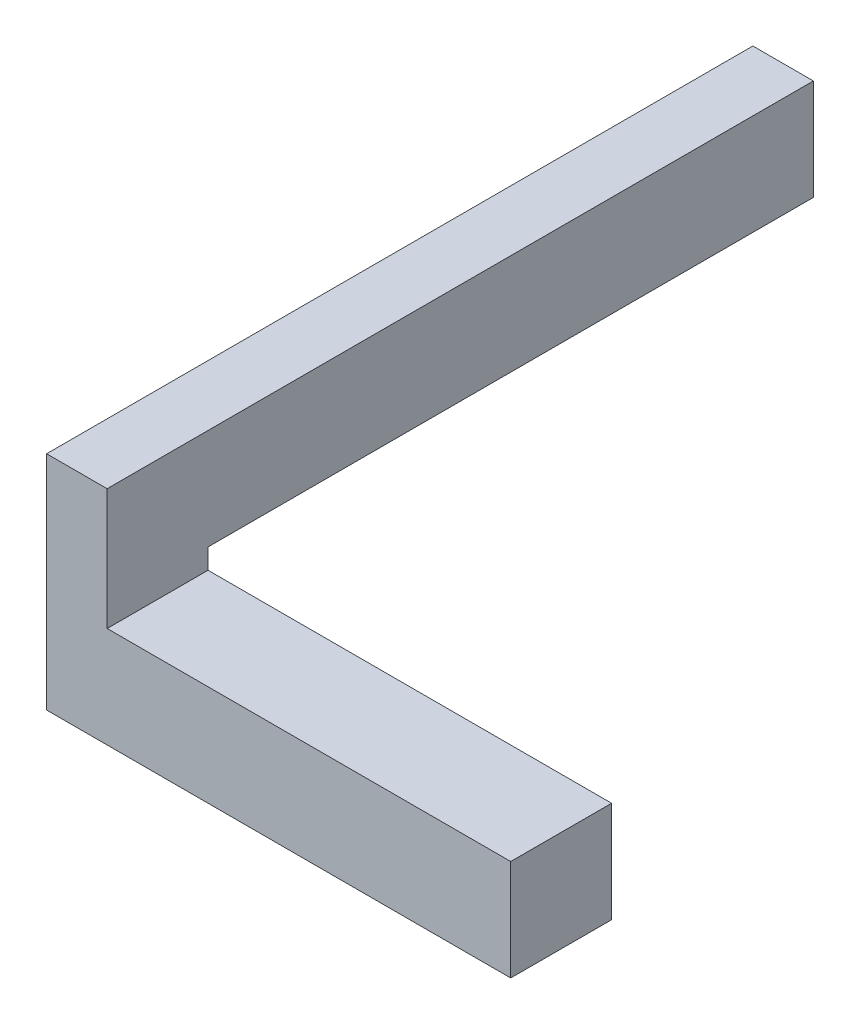
ISO-10303-21;
HEADER;
FILE_DESCRIPTION(('STEP AP214'),'2;1');
FILE_NAME('part.step','',(''),(''),'','','');
FILE_SCHEMA(('AUTOMOTIVE_DESIGN { 1 0 10303 214 1 1 1 1 }'));
ENDSEC;
DATA;
#1=APPLICATION_CONTEXT('core data for automotive mechanical design processes');
#2=APPLICATION_PROTOCOL_DEFINITION('international standard','automotive_design',2000,#1);
#3=PRODUCT_CONTEXT('',#1,'mechanical');
#4=PRODUCT('Part','Part','',(#3));
#5=PRODUCT_RELATED_PRODUCT_CATEGORY('part','',(#4));
#6=PRODUCT_DEFINITION_FORMATION('','',#4);
#7=PRODUCT_DEFINITION_CONTEXT('part definition',#1,'design');
#8=PRODUCT_DEFINITION('design','',#6,#7);
#9=PRODUCT_DEFINITION_SHAPE('','',#8);
#10=(LENGTH_UNIT() NAMED_UNIT(*) SI_UNIT(.MILLI.,.METRE.));
#11=(NAMED_UNIT(*) PLANE_ANGLE_UNIT() SI_UNIT($,.RADIAN.));
#12=(NAMED_UNIT(*) SI_UNIT($,.STERADIAN.) SOLID_ANGLE_UNIT());
#13=UNCERTAINTY_MEASURE_WITH_UNIT(LENGTH_MEASURE(1.E-05),#10,'distance_accuracy_value','');
#14=(GEOMETRIC_REPRESENTATION_CONTEXT(3) GLOBAL_UNCERTAINTY_ASSIGNED_CONTEXT((#13)) GLOBAL_UNIT_ASSIGNED_CONTEXT((#10,
#11,#12)) REPRESENTATION_CONTEXT('',''));
#15=CARTESIAN_POINT('',(0.,0.,0.));
#16=DIRECTION('',(0.,0.,1.));
#17=DIRECTION('',(1.,0.,0.));
#18=AXIS2_PLACEMENT_3D('',#15,#16,#17);
#19=CARTESIAN_POINT('',(3.,-5.,70.));
#20=DIRECTION('',(-1.,0.,0.));
#21=DIRECTION('',(0.,0.,1.));
#22=AXIS2_PLACEMENT_3D('',#19,#20,#21);
#23=PLANE('',#22);
#24=DIRECTION('',(0.,0.,1.));
#25=VECTOR('',#24,1.);
#26=CARTESIAN_POINT('',(3.,-7.,70.));
#27=LINE('',#26,#25);
#28=CARTESIAN_POINT('',(3.,-7.,60.));
#29=VERTEX_POINT('',#28);
#30=CARTESIAN_POINT('',(3.,-7.,70.));
#31=VERTEX_POINT('',#30);
#32=EDGE_CURVE('E52',#29,#31,#27,.T.);
#33=ORIENTED_EDGE('',*,*,#32,.F.);
#34=DIRECTION('',(0.,1.,0.));
#35=VECTOR('',#34,1.);
#36=CARTESIAN_POINT('',(3.,-17.,60.));
#37=LINE('',#36,#35);
#38=CARTESIAN_POINT('',(3.,-5.,60.));
#39=VERTEX_POINT('',#38);
#40=EDGE_CURVE('E143',#29,#39,#37,.T.);
#41=ORIENTED_EDGE('',*,*,#40,.T.);
#42=DIRECTION('',(0.,0.,-1.));
#43=VECTOR('',#42,1.);
#44=CARTESIAN_POINT('',(3.,-5.,70.));
#45=LINE('',#44,#43);
#46=CARTESIAN_POINT('',(3.,-5.,0.));
#47=VERTEX_POINT('',#46);
#48=EDGE_CURVE('E152',#39,#47,#45,.T.);
#49=ORIENTED_EDGE('',*,*,#48,.T.);
#50=DIRECTION('',(0.,1.,0.));
#51=VECTOR('',#50,1.);
#52=CARTESIAN_POINT('',(3.,-5.,0.));
#53=LINE('',#52,#51);
#54=CARTESIAN_POINT('',(3.,5.,0.));
#55=VERTEX_POINT('',#54);
#56=EDGE_CURVE('E150',#47,#55,#53,.T.);
#57=ORIENTED_EDGE('',*,*,#56,.T.);
#58=DIRECTION('',(0.,0.,-1.));
#59=VECTOR('',#58,1.);
#60=CARTESIAN_POINT('',(3.,5.,70.));
#61=LINE('',#60,#59);
#62=CARTESIAN_POINT('',(3.,5.,70.));
#63=VERTEX_POINT('',#62);
#64=EDGE_CURVE('E11',#63,#55,#61,.T.);
#65=ORIENTED_EDGE('',*,*,#64,.F.);
#66=DIRECTION('',(0.,1.,0.));
#67=VECTOR('',#66,1.);
#68=CARTESIAN_POINT('',(3.,-5.,70.));
#69=LINE('',#68,#67);
#70=EDGE_CURVE('E146',#31,#63,#69,.T.);
#71=ORIENTED_EDGE('',*,*,#70,.F.);
#72=EDGE_LOOP('',(#33,#41,#49,#57,#65,#71));
#73=FACE_BOUND('',#72,.T.);
#74=ADVANCED_FACE('F39',(#73),#23,.F.);
#75=CARTESIAN_POINT('',(-3.,-5.,70.));
#76=DIRECTION('',(0.,1.,0.));
#77=DIRECTION('',(0.,0.,1.));
#78=AXIS2_PLACEMENT_3D('',#75,#76,#77);
#79=PLANE('',#78);
#80=DIRECTION('',(1.,0.,0.));
#81=VECTOR('',#80,1.);
#82=CARTESIAN_POINT('',(3.,-5.,60.));
#83=LINE('',#82,#81);
#84=CARTESIAN_POINT('',(-3.,-5.,60.));
#85=VERTEX_POINT('',#84);
#86=EDGE_CURVE('E64',#85,#39,#83,.T.);
#87=ORIENTED_EDGE('',*,*,#86,.F.);
#88=DIRECTION('',(0.,0.,-1.));
#89=VECTOR('',#88,1.);
#90=CARTESIAN_POINT('',(-3.,-5.,70.));
#91=LINE('',#90,#89);
#92=CARTESIAN_POINT('',(-3.,-5.,0.));
#93=VERTEX_POINT('',#92);
#94=EDGE_CURVE('E164',#85,#93,#91,.T.);
#95=ORIENTED_EDGE('',*,*,#94,.T.);
#96=DIRECTION('',(1.,0.,0.));
#97=VECTOR('',#96,1.);
#98=CARTESIAN_POINT('',(-3.,-5.,0.));
#99=LINE('',#98,#97);
#100=EDGE_CURVE('E151',#93,#47,#99,.T.);
#101=ORIENTED_EDGE('',*,*,#100,.T.);
#102=ORIENTED_EDGE('',*,*,#48,.F.);
#103=EDGE_LOOP('',(#87,#95,#101,#102));
#104=FACE_BOUND('',#103,.T.);
#105=ADVANCED_FACE('F179',(#104),#79,.F.);
#106=CARTESIAN_POINT('',(-3.,5.,70.));
#107=DIRECTION('',(0.,-1.,0.));
#108=DIRECTION('',(0.,0.,-1.));
#109=AXIS2_PLACEMENT_3D('',#106,#107,#108);
#110=PLANE('',#109);
#111=DIRECTION('',(-1.,0.,0.));
#112=VECTOR('',#111,1.);
#113=CARTESIAN_POINT('',(-3.,5.,0.));
#114=LINE('',#113,#112);
#115=CARTESIAN_POINT('',(-3.,5.,0.));
#116=VERTEX_POINT('',#115);
#117=EDGE_CURVE('E160',#55,#116,#114,.T.);
#118=ORIENTED_EDGE('',*,*,#117,.T.);
#119=DIRECTION('',(0.,0.,-1.));
#120=VECTOR('',#119,1.);
#121=CARTESIAN_POINT('',(-3.,5.,70.));
#122=LINE('',#121,#120);
#123=CARTESIAN_POINT('',(-3.,5.,70.));
#124=VERTEX_POINT('',#123);
#125=EDGE_CURVE('E46',#124,#116,#122,.T.);
#126=ORIENTED_EDGE('',*,*,#125,.F.);
#127=DIRECTION('',(-1.,0.,0.));
#128=VECTOR('',#127,1.);
#129=CARTESIAN_POINT('',(-3.,5.,70.));
#130=LINE('',#129,#128);
#131=EDGE_CURVE('E147',#63,#124,#130,.T.);
#132=ORIENTED_EDGE('',*,*,#131,.F.);
#133=ORIENTED_EDGE('',*,*,#64,.T.);
#134=EDGE_LOOP('',(#118,#126,#132,#133));
#135=FACE_BOUND('',#134,.T.);
#136=ADVANCED_FACE('F183',(#135),#110,.F.);
#137=CARTESIAN_POINT('',(-3.,-5.,70.));
#138=DIRECTION('',(1.,0.,0.));
#139=DIRECTION('',(0.,0.,-1.));
#140=AXIS2_PLACEMENT_3D('',#137,#138,#139);
#141=PLANE('',#140);
#142=DIRECTION('',(0.,-1.,0.));
#143=VECTOR('',#142,1.);
#144=CARTESIAN_POINT('',(-3.,-5.,0.));
#145=LINE('',#144,#143);
#146=EDGE_CURVE('E157',#116,#93,#145,.T.);
#147=ORIENTED_EDGE('',*,*,#146,.T.);
#148=ORIENTED_EDGE('',*,*,#94,.F.);
#149=DIRECTION('',(0.,1.,0.));
#150=VECTOR('',#149,1.);
#151=CARTESIAN_POINT('',(-3.,-17.,60.));
#152=LINE('',#151,#150);
#153=CARTESIAN_POINT('',(-3.,-17.,60.));
#154=VERTEX_POINT('',#153);
#155=EDGE_CURVE('E145',#154,#85,#152,.T.);
#156=ORIENTED_EDGE('',*,*,#155,.F.);
#157=DIRECTION('',(0.,0.,-1.));
#158=VECTOR('',#157,1.);
#159=CARTESIAN_POINT('',(-3.,-17.,70.));
#160=LINE('',#159,#158);
#161=CARTESIAN_POINT('',(-3.,-17.,70.));
#162=VERTEX_POINT('',#161);
#163=EDGE_CURVE('E111',#162,#154,#160,.T.);
#164=ORIENTED_EDGE('',*,*,#163,.F.);
#165=DIRECTION('',(0.,-1.,0.));
#166=VECTOR('',#165,1.);
#167=CARTESIAN_POINT('',(-3.,-5.,70.));
#168=LINE('',#167,#166);
#169=EDGE_CURVE('E112',#124,#162,#168,.T.);
#170=ORIENTED_EDGE('',*,*,#169,.F.);
#171=ORIENTED_EDGE('',*,*,#125,.T.);
#172=EDGE_LOOP('',(#147,#148,#156,#164,#170,#171));
#173=FACE_BOUND('',#172,.T.);
#174=ADVANCED_FACE('F168',(#173),#141,.F.);
#175=CARTESIAN_POINT('',(0.,0.,70.));
#176=DIRECTION('',(0.,0.,-1.));
#177=DIRECTION('',(-1.,0.,0.));
#178=AXIS2_PLACEMENT_3D('',#175,#176,#177);
#179=PLANE('',#178);
#180=DIRECTION('',(-1.,0.,0.));
#181=VECTOR('',#180,1.);
#182=CARTESIAN_POINT('',(3.,-17.,70.));
#183=LINE('',#182,#181);
#184=CARTESIAN_POINT('',(43.,-17.,70.));
#185=VERTEX_POINT('',#184);
#186=EDGE_CURVE('E102',#185,#162,#183,.T.);
#187=ORIENTED_EDGE('',*,*,#186,.F.);
#188=DIRECTION('',(0.,-1.,0.));
#189=VECTOR('',#188,1.);
#190=CARTESIAN_POINT('',(43.,-17.,70.));
#191=LINE('',#190,#189);
#192=CARTESIAN_POINT('',(43.,-7.,70.));
#193=VERTEX_POINT('',#192);
#194=EDGE_CURVE('E108',#193,#185,#191,.T.);
#195=ORIENTED_EDGE('',*,*,#194,.F.);
#196=DIRECTION('',(-1.,0.,0.));
#197=VECTOR('',#196,1.);
#198=CARTESIAN_POINT('',(43.,-7.,70.));
#199=LINE('',#198,#197);
#200=EDGE_CURVE('E135',#193,#31,#199,.T.);
#201=ORIENTED_EDGE('',*,*,#200,.T.);
#202=ORIENTED_EDGE('',*,*,#70,.T.);
#203=ORIENTED_EDGE('',*,*,#131,.T.);
#204=ORIENTED_EDGE('',*,*,#169,.T.);
#205=EDGE_LOOP('',(#187,#195,#201,#202,#203,#204));
#206=FACE_BOUND('',#205,.T.);
#207=ADVANCED_FACE('F106',(#206),#179,.F.);
#208=CARTESIAN_POINT('',(0.,0.,0.));
#209=DIRECTION('',(0.,0.,-1.));
#210=DIRECTION('',(-1.,0.,0.));
#211=AXIS2_PLACEMENT_3D('',#208,#209,#210);
#212=PLANE('',#211);
#213=ORIENTED_EDGE('',*,*,#56,.F.);
#214=ORIENTED_EDGE('',*,*,#100,.F.);
#215=ORIENTED_EDGE('',*,*,#146,.F.);
#216=ORIENTED_EDGE('',*,*,#117,.F.);
#217=EDGE_LOOP('',(#213,#214,#215,#216));
#218=FACE_BOUND('',#217,.T.);
#219=ADVANCED_FACE('F178',(#218),#212,.T.);
#220=CARTESIAN_POINT('',(3.,-17.,60.));
#221=DIRECTION('',(0.,0.,1.));
#222=DIRECTION('',(1.,0.,0.));
#223=AXIS2_PLACEMENT_3D('',#220,#221,#222);
#224=PLANE('',#223);
#225=ORIENTED_EDGE('',*,*,#86,.T.);
#226=ORIENTED_EDGE('',*,*,#40,.F.);
#227=DIRECTION('',(-1.,0.,0.));
#228=VECTOR('',#227,1.);
#229=CARTESIAN_POINT('',(43.,-7.,60.));
#230=LINE('',#229,#228);
#231=CARTESIAN_POINT('',(43.,-7.,60.));
#232=VERTEX_POINT('',#231);
#233=EDGE_CURVE('E138',#232,#29,#230,.T.);
#234=ORIENTED_EDGE('',*,*,#233,.F.);
#235=DIRECTION('',(0.,1.,0.));
#236=VECTOR('',#235,1.);
#237=CARTESIAN_POINT('',(43.,-17.,60.));
#238=LINE('',#237,#236);
#239=CARTESIAN_POINT('',(43.,-17.,60.));
#240=VERTEX_POINT('',#239);
#241=EDGE_CURVE('E122',#240,#232,#238,.T.);
#242=ORIENTED_EDGE('',*,*,#241,.F.);
#243=DIRECTION('',(1.,0.,0.));
#244=VECTOR('',#243,1.);
#245=CARTESIAN_POINT('',(3.,-17.,60.));
#246=LINE('',#245,#244);
#247=EDGE_CURVE('E117',#154,#240,#246,.T.);
#248=ORIENTED_EDGE('',*,*,#247,.F.);
#249=ORIENTED_EDGE('',*,*,#155,.T.);
#250=EDGE_LOOP('',(#225,#226,#234,#242,#248,#249));
#251=FACE_BOUND('',#250,.T.);
#252=ADVANCED_FACE('F176',(#251),#224,.F.);
#253=CARTESIAN_POINT('',(0.,-17.,0.));
#254=DIRECTION('',(0.,1.,0.));
#255=DIRECTION('',(0.,0.,1.));
#256=AXIS2_PLACEMENT_3D('',#253,#254,#255);
#257=PLANE('',#256);
#258=ORIENTED_EDGE('',*,*,#247,.T.);
#259=DIRECTION('',(0.,0.,-1.));
#260=VECTOR('',#259,1.);
#261=CARTESIAN_POINT('',(43.,-17.,70.));
#262=LINE('',#261,#260);
#263=EDGE_CURVE('E116',#185,#240,#262,.T.);
#264=ORIENTED_EDGE('',*,*,#263,.F.);
#265=ORIENTED_EDGE('',*,*,#186,.T.);
#266=ORIENTED_EDGE('',*,*,#163,.T.);
#267=EDGE_LOOP('',(#258,#264,#265,#266));
#268=FACE_BOUND('',#267,.T.);
#269=ADVANCED_FACE('F120',(#268),#257,.F.);
#270=CARTESIAN_POINT('',(43.,-7.,70.));
#271=DIRECTION('',(0.,-1.,0.));
#272=DIRECTION('',(0.,0.,-1.));
#273=AXIS2_PLACEMENT_3D('',#270,#271,#272);
#274=PLANE('',#273);
#275=ORIENTED_EDGE('',*,*,#32,.T.);
#276=ORIENTED_EDGE('',*,*,#200,.F.);
#277=DIRECTION('',(0.,0.,1.));
#278=VECTOR('',#277,1.);
#279=CARTESIAN_POINT('',(43.,-7.,70.));
#280=LINE('',#279,#278);
#281=EDGE_CURVE('E130',#232,#193,#280,.T.);
#282=ORIENTED_EDGE('',*,*,#281,.F.);
#283=ORIENTED_EDGE('',*,*,#233,.T.);
#284=EDGE_LOOP('',(#275,#276,#282,#283));
#285=FACE_BOUND('',#284,.T.);
#286=ADVANCED_FACE('F181',(#285),#274,.F.);
#287=CARTESIAN_POINT('',(43.,0.,0.));
#288=DIRECTION('',(-1.,0.,0.));
#289=DIRECTION('',(0.,0.,1.));
#290=AXIS2_PLACEMENT_3D('',#287,#288,#289);
#291=PLANE('',#290);
#292=ORIENTED_EDGE('',*,*,#194,.T.);
#293=ORIENTED_EDGE('',*,*,#263,.T.);
#294=ORIENTED_EDGE('',*,*,#241,.T.);
#295=ORIENTED_EDGE('',*,*,#281,.T.);
#296=EDGE_LOOP('',(#292,#293,#294,#295));
#297=FACE_BOUND('',#296,.T.);
#298=ADVANCED_FACE('F121',(#297),#291,.F.);
#299=CLOSED_SHELL('',(#74,#105,#136,#174,#207,#219,#252,#269,#286,#298));
#300=MANIFOLD_SOLID_BREP('B2',#299);
#301=ADVANCED_BREP_SHAPE_REPRESENTATION('',(#18,#300),#14);
#302=SHAPE_DEFINITION_REPRESENTATION(#9,#301);
ENDSEC;
END-ISO-10303-21;
